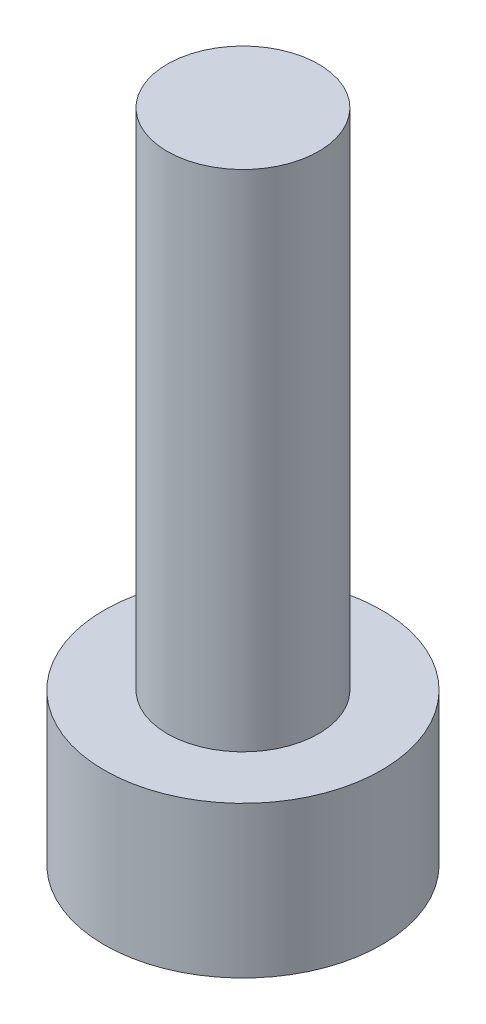
ISO-10303-21;
HEADER;
FILE_DESCRIPTION(('STEP AP214'),'2;1');
FILE_NAME('part.step','',(''),(''),'','','');
FILE_SCHEMA(('AUTOMOTIVE_DESIGN { 1 0 10303 214 1 1 1 1 }'));
ENDSEC;
DATA;
#1=APPLICATION_CONTEXT('core data for automotive mechanical design processes');
#2=APPLICATION_PROTOCOL_DEFINITION('international standard','automotive_design',2000,#1);
#3=PRODUCT_CONTEXT('',#1,'mechanical');
#4=PRODUCT('Part','Part','',(#3));
#5=PRODUCT_RELATED_PRODUCT_CATEGORY('part','',(#4));
#6=PRODUCT_DEFINITION_FORMATION('','',#4);
#7=PRODUCT_DEFINITION_CONTEXT('part definition',#1,'design');
#8=PRODUCT_DEFINITION('design','',#6,#7);
#9=PRODUCT_DEFINITION_SHAPE('','',#8);
#10=(LENGTH_UNIT() NAMED_UNIT(*) SI_UNIT(.MILLI.,.METRE.));
#11=(NAMED_UNIT(*) PLANE_ANGLE_UNIT() SI_UNIT($,.RADIAN.));
#12=(NAMED_UNIT(*) SI_UNIT($,.STERADIAN.) SOLID_ANGLE_UNIT());
#13=UNCERTAINTY_MEASURE_WITH_UNIT(LENGTH_MEASURE(1.E-05),#10,'distance_accuracy_value','');
#14=(GEOMETRIC_REPRESENTATION_CONTEXT(3) GLOBAL_UNCERTAINTY_ASSIGNED_CONTEXT((#13)) GLOBAL_UNIT_ASSIGNED_CONTEXT((#10,
#11,#12)) REPRESENTATION_CONTEXT('',''));
#15=CARTESIAN_POINT('',(0.,0.,0.));
#16=DIRECTION('',(0.,0.,1.));
#17=DIRECTION('',(1.,0.,0.));
#18=AXIS2_PLACEMENT_3D('',#15,#16,#17);
#19=CARTESIAN_POINT('',(0.,0.,0.));
#20=DIRECTION('',(0.,1.,0.));
#21=DIRECTION('',(0.,0.,1.));
#22=AXIS2_PLACEMENT_3D('',#19,#20,#21);
#23=PLANE('',#22);
#24=DIRECTION('',(0.866025403784439,0.,0.5));
#25=VECTOR('',#24,1.);
#26=CARTESIAN_POINT('',(0.,0.,-1.375));
#27=LINE('',#26,#25);
#28=CARTESIAN_POINT('',(0.,0.,-1.375));
#29=VERTEX_POINT('',#28);
#30=CARTESIAN_POINT('',(1.1907849302036,0.,-0.6875));
#31=VERTEX_POINT('',#30);
#32=EDGE_CURVE('E122',#29,#31,#27,.T.);
#33=ORIENTED_EDGE('',*,*,#32,.F.);
#34=DIRECTION('',(0.866025403784439,0.,-0.5));
#35=VECTOR('',#34,1.);
#36=CARTESIAN_POINT('',(-1.1907849302036,0.,-0.6875));
#37=LINE('',#36,#35);
#38=CARTESIAN_POINT('',(-1.1907849302036,0.,-0.6875));
#39=VERTEX_POINT('',#38);
#40=EDGE_CURVE('E48',#39,#29,#37,.T.);
#41=ORIENTED_EDGE('',*,*,#40,.F.);
#42=DIRECTION('',(0.,0.,-1.));
#43=VECTOR('',#42,1.);
#44=CARTESIAN_POINT('',(-1.1907849302036,0.,0.6875));
#45=LINE('',#44,#43);
#46=CARTESIAN_POINT('',(-1.1907849302036,0.,0.6875));
#47=VERTEX_POINT('',#46);
#48=EDGE_CURVE('E131',#47,#39,#45,.T.);
#49=ORIENTED_EDGE('',*,*,#48,.F.);
#50=DIRECTION('',(-0.866025403784439,0.,-0.5));
#51=VECTOR('',#50,1.);
#52=CARTESIAN_POINT('',(0.,0.,1.375));
#53=LINE('',#52,#51);
#54=CARTESIAN_POINT('',(0.,0.,1.375));
#55=VERTEX_POINT('',#54);
#56=EDGE_CURVE('E129',#55,#47,#53,.T.);
#57=ORIENTED_EDGE('',*,*,#56,.F.);
#58=DIRECTION('',(-0.866025403784439,0.,0.5));
#59=VECTOR('',#58,1.);
#60=CARTESIAN_POINT('',(1.1907849302036,0.,0.687500000000001));
#61=LINE('',#60,#59);
#62=CARTESIAN_POINT('',(1.1907849302036,0.,0.687500000000001));
#63=VERTEX_POINT('',#62);
#64=EDGE_CURVE('E96',#63,#55,#61,.T.);
#65=ORIENTED_EDGE('',*,*,#64,.F.);
#66=DIRECTION('',(0.,0.,1.));
#67=VECTOR('',#66,1.);
#68=CARTESIAN_POINT('',(1.1907849302036,0.,-0.6875));
#69=LINE('',#68,#67);
#70=EDGE_CURVE('E125',#31,#63,#69,.T.);
#71=ORIENTED_EDGE('',*,*,#70,.F.);
#72=EDGE_LOOP('',(#33,#41,#49,#57,#65,#71));
#73=FACE_BOUND('',#72,.T.);
#74=CARTESIAN_POINT('',(0.,0.,0.));
#75=DIRECTION('',(0.,1.,0.));
#76=DIRECTION('',(0.,0.,1.));
#77=AXIS2_PLACEMENT_3D('',#74,#75,#76);
#78=CIRCLE('',#77,2.75);
#79=CARTESIAN_POINT('',(0.,0.,2.75));
#80=VERTEX_POINT('',#79);
#81=EDGE_CURVE('E11',#80,#80,#78,.T.);
#82=ORIENTED_EDGE('',*,*,#81,.F.);
#83=EDGE_LOOP('',(#82));
#84=FACE_BOUND('',#83,.T.);
#85=ADVANCED_FACE('F34',(#73,#84),#23,.F.);
#86=CARTESIAN_POINT('',(0.,5.07932498206899,0.));
#87=DIRECTION('',(0.,1.,0.));
#88=DIRECTION('',(0.,0.,1.));
#89=AXIS2_PLACEMENT_3D('',#86,#87,#88);
#90=CYLINDRICAL_SURFACE('',#89,2.75);
#91=CARTESIAN_POINT('',(0.,3.,0.));
#92=DIRECTION('',(0.,1.,0.));
#93=DIRECTION('',(0.,0.,1.));
#94=AXIS2_PLACEMENT_3D('',#91,#92,#93);
#95=CIRCLE('',#94,2.75);
#96=CARTESIAN_POINT('',(0.,3.,2.75));
#97=VERTEX_POINT('',#96);
#98=EDGE_CURVE('E41',#97,#97,#95,.T.);
#99=ORIENTED_EDGE('',*,*,#98,.F.);
#100=EDGE_LOOP('',(#99));
#101=FACE_BOUND('',#100,.T.);
#102=ORIENTED_EDGE('',*,*,#81,.T.);
#103=EDGE_LOOP('',(#102));
#104=FACE_BOUND('',#103,.T.);
#105=ADVANCED_FACE('F150',(#101,#104),#90,.T.);
#106=CARTESIAN_POINT('',(2.75,3.,0.));
#107=DIRECTION('',(0.,-1.,0.));
#108=DIRECTION('',(0.,0.,-1.));
#109=AXIS2_PLACEMENT_3D('',#106,#107,#108);
#110=PLANE('',#109);
#111=CARTESIAN_POINT('',(0.,3.,0.));
#112=DIRECTION('',(0.,1.,0.));
#113=DIRECTION('',(0.,0.,1.));
#114=AXIS2_PLACEMENT_3D('',#111,#112,#113);
#115=CIRCLE('',#114,1.5);
#116=CARTESIAN_POINT('',(0.,3.,1.5));
#117=VERTEX_POINT('',#116);
#118=EDGE_CURVE('E143',#117,#117,#115,.T.);
#119=ORIENTED_EDGE('',*,*,#118,.F.);
#120=EDGE_LOOP('',(#119));
#121=FACE_BOUND('',#120,.T.);
#122=ORIENTED_EDGE('',*,*,#98,.T.);
#123=EDGE_LOOP('',(#122));
#124=FACE_BOUND('',#123,.T.);
#125=ADVANCED_FACE('F148',(#121,#124),#110,.F.);
#126=CARTESIAN_POINT('',(0.,5.07932498206899,0.));
#127=DIRECTION('',(0.,1.,0.));
#128=DIRECTION('',(0.,0.,1.));
#129=AXIS2_PLACEMENT_3D('',#126,#127,#128);
#130=CYLINDRICAL_SURFACE('',#129,1.5);
#131=CARTESIAN_POINT('',(0.,13.,0.));
#132=DIRECTION('',(0.,1.,0.));
#133=DIRECTION('',(0.,0.,1.));
#134=AXIS2_PLACEMENT_3D('',#131,#132,#133);
#135=CIRCLE('',#134,1.5);
#136=CARTESIAN_POINT('',(0.,13.,1.5));
#137=VERTEX_POINT('',#136);
#138=EDGE_CURVE('E135',#137,#137,#135,.T.);
#139=ORIENTED_EDGE('',*,*,#138,.F.);
#140=EDGE_LOOP('',(#139));
#141=FACE_BOUND('',#140,.T.);
#142=ORIENTED_EDGE('',*,*,#118,.T.);
#143=EDGE_LOOP('',(#142));
#144=FACE_BOUND('',#143,.T.);
#145=ADVANCED_FACE('F175',(#141,#144),#130,.T.);
#146=CARTESIAN_POINT('',(1.5,13.,0.));
#147=DIRECTION('',(0.,-1.,0.));
#148=DIRECTION('',(0.,0.,-1.));
#149=AXIS2_PLACEMENT_3D('',#146,#147,#148);
#150=PLANE('',#149);
#151=ORIENTED_EDGE('',*,*,#138,.T.);
#152=EDGE_LOOP('',(#151));
#153=FACE_BOUND('',#152,.T.);
#154=ADVANCED_FACE('F168',(#153),#150,.F.);
#155=CARTESIAN_POINT('',(-1.1907849302036,1.5,-0.6875));
#156=DIRECTION('',(-0.5,0.,-0.866025403784439));
#157=DIRECTION('',(-0.866025403784439,0.,0.5));
#158=AXIS2_PLACEMENT_3D('',#155,#156,#157);
#159=PLANE('',#158);
#160=ORIENTED_EDGE('',*,*,#40,.T.);
#161=DIRECTION('',(0.,-1.,0.));
#162=VECTOR('',#161,1.);
#163=CARTESIAN_POINT('',(0.,1.5,-1.375));
#164=LINE('',#163,#162);
#165=CARTESIAN_POINT('',(0.,1.5,-1.375));
#166=VERTEX_POINT('',#165);
#167=EDGE_CURVE('E78',#166,#29,#164,.T.);
#168=ORIENTED_EDGE('',*,*,#167,.F.);
#169=DIRECTION('',(0.866025403784439,0.,-0.5));
#170=VECTOR('',#169,1.);
#171=CARTESIAN_POINT('',(-1.1907849302036,1.5,-0.6875));
#172=LINE('',#171,#170);
#173=CARTESIAN_POINT('',(-1.1907849302036,1.5,-0.6875));
#174=VERTEX_POINT('',#173);
#175=EDGE_CURVE('E133',#174,#166,#172,.T.);
#176=ORIENTED_EDGE('',*,*,#175,.F.);
#177=DIRECTION('',(0.,-1.,0.));
#178=VECTOR('',#177,1.);
#179=CARTESIAN_POINT('',(-1.1907849302036,1.5,-0.6875));
#180=LINE('',#179,#178);
#181=EDGE_CURVE('E56',#174,#39,#180,.T.);
#182=ORIENTED_EDGE('',*,*,#181,.T.);
#183=EDGE_LOOP('',(#160,#168,#176,#182));
#184=FACE_BOUND('',#183,.T.);
#185=ADVANCED_FACE('F165',(#184),#159,.F.);
#186=CARTESIAN_POINT('',(-1.1907849302036,1.5,0.6875));
#187=DIRECTION('',(-1.,0.,0.));
#188=DIRECTION('',(0.,0.,1.));
#189=AXIS2_PLACEMENT_3D('',#186,#187,#188);
#190=PLANE('',#189);
#191=ORIENTED_EDGE('',*,*,#48,.T.);
#192=ORIENTED_EDGE('',*,*,#181,.F.);
#193=DIRECTION('',(0.,0.,-1.));
#194=VECTOR('',#193,1.);
#195=CARTESIAN_POINT('',(-1.1907849302036,1.5,0.6875));
#196=LINE('',#195,#194);
#197=CARTESIAN_POINT('',(-1.1907849302036,1.5,0.6875));
#198=VERTEX_POINT('',#197);
#199=EDGE_CURVE('E108',#198,#174,#196,.T.);
#200=ORIENTED_EDGE('',*,*,#199,.F.);
#201=DIRECTION('',(0.,-1.,0.));
#202=VECTOR('',#201,1.);
#203=CARTESIAN_POINT('',(-1.1907849302036,1.5,0.6875));
#204=LINE('',#203,#202);
#205=EDGE_CURVE('E100',#198,#47,#204,.T.);
#206=ORIENTED_EDGE('',*,*,#205,.T.);
#207=EDGE_LOOP('',(#191,#192,#200,#206));
#208=FACE_BOUND('',#207,.T.);
#209=ADVANCED_FACE('F167',(#208),#190,.F.);
#210=CARTESIAN_POINT('',(0.,1.5,1.375));
#211=DIRECTION('',(-0.5,0.,0.866025403784439));
#212=DIRECTION('',(0.866025403784439,0.,0.5));
#213=AXIS2_PLACEMENT_3D('',#210,#211,#212);
#214=PLANE('',#213);
#215=ORIENTED_EDGE('',*,*,#56,.T.);
#216=ORIENTED_EDGE('',*,*,#205,.F.);
#217=DIRECTION('',(-0.866025403784439,0.,-0.5));
#218=VECTOR('',#217,1.);
#219=CARTESIAN_POINT('',(0.,1.5,1.375));
#220=LINE('',#219,#218);
#221=CARTESIAN_POINT('',(0.,1.5,1.375));
#222=VERTEX_POINT('',#221);
#223=EDGE_CURVE('E104',#222,#198,#220,.T.);
#224=ORIENTED_EDGE('',*,*,#223,.F.);
#225=DIRECTION('',(0.,-1.,0.));
#226=VECTOR('',#225,1.);
#227=CARTESIAN_POINT('',(0.,1.5,1.375));
#228=LINE('',#227,#226);
#229=EDGE_CURVE('E89',#222,#55,#228,.T.);
#230=ORIENTED_EDGE('',*,*,#229,.T.);
#231=EDGE_LOOP('',(#215,#216,#224,#230));
#232=FACE_BOUND('',#231,.T.);
#233=ADVANCED_FACE('F105',(#232),#214,.F.);
#234=CARTESIAN_POINT('',(1.1907849302036,1.5,0.687500000000001));
#235=DIRECTION('',(0.5,0.,0.866025403784439));
#236=DIRECTION('',(0.866025403784439,0.,-0.5));
#237=AXIS2_PLACEMENT_3D('',#234,#235,#236);
#238=PLANE('',#237);
#239=ORIENTED_EDGE('',*,*,#64,.T.);
#240=ORIENTED_EDGE('',*,*,#229,.F.);
#241=DIRECTION('',(-0.866025403784439,0.,0.5));
#242=VECTOR('',#241,1.);
#243=CARTESIAN_POINT('',(1.1907849302036,1.5,0.687500000000001));
#244=LINE('',#243,#242);
#245=CARTESIAN_POINT('',(1.1907849302036,1.5,0.687500000000001));
#246=VERTEX_POINT('',#245);
#247=EDGE_CURVE('E93',#246,#222,#244,.T.);
#248=ORIENTED_EDGE('',*,*,#247,.F.);
#249=DIRECTION('',(0.,-1.,0.));
#250=VECTOR('',#249,1.);
#251=CARTESIAN_POINT('',(1.1907849302036,1.5,0.687500000000001));
#252=LINE('',#251,#250);
#253=EDGE_CURVE('E101',#246,#63,#252,.T.);
#254=ORIENTED_EDGE('',*,*,#253,.T.);
#255=EDGE_LOOP('',(#239,#240,#248,#254));
#256=FACE_BOUND('',#255,.T.);
#257=ADVANCED_FACE('F91',(#256),#238,.F.);
#258=CARTESIAN_POINT('',(1.1907849302036,1.5,-0.6875));
#259=DIRECTION('',(1.,0.,0.));
#260=DIRECTION('',(0.,0.,-1.));
#261=AXIS2_PLACEMENT_3D('',#258,#259,#260);
#262=PLANE('',#261);
#263=ORIENTED_EDGE('',*,*,#70,.T.);
#264=ORIENTED_EDGE('',*,*,#253,.F.);
#265=DIRECTION('',(0.,0.,1.));
#266=VECTOR('',#265,1.);
#267=CARTESIAN_POINT('',(1.1907849302036,1.5,-0.6875));
#268=LINE('',#267,#266);
#269=CARTESIAN_POINT('',(1.1907849302036,1.5,-0.6875));
#270=VERTEX_POINT('',#269);
#271=EDGE_CURVE('E114',#270,#246,#268,.T.);
#272=ORIENTED_EDGE('',*,*,#271,.F.);
#273=DIRECTION('',(0.,-1.,0.));
#274=VECTOR('',#273,1.);
#275=CARTESIAN_POINT('',(1.1907849302036,1.5,-0.6875));
#276=LINE('',#275,#274);
#277=EDGE_CURVE('E138',#270,#31,#276,.T.);
#278=ORIENTED_EDGE('',*,*,#277,.T.);
#279=EDGE_LOOP('',(#263,#264,#272,#278));
#280=FACE_BOUND('',#279,.T.);
#281=ADVANCED_FACE('F232',(#280),#262,.F.);
#282=CARTESIAN_POINT('',(0.,1.5,-1.375));
#283=DIRECTION('',(0.5,0.,-0.866025403784439));
#284=DIRECTION('',(-0.866025403784439,0.,-0.5));
#285=AXIS2_PLACEMENT_3D('',#282,#283,#284);
#286=PLANE('',#285);
#287=ORIENTED_EDGE('',*,*,#32,.T.);
#288=ORIENTED_EDGE('',*,*,#277,.F.);
#289=DIRECTION('',(0.866025403784439,0.,0.5));
#290=VECTOR('',#289,1.);
#291=CARTESIAN_POINT('',(0.,1.5,-1.375));
#292=LINE('',#291,#290);
#293=EDGE_CURVE('E116',#166,#270,#292,.T.);
#294=ORIENTED_EDGE('',*,*,#293,.F.);
#295=ORIENTED_EDGE('',*,*,#167,.T.);
#296=EDGE_LOOP('',(#287,#288,#294,#295));
#297=FACE_BOUND('',#296,.T.);
#298=ADVANCED_FACE('F163',(#297),#286,.F.);
#299=CARTESIAN_POINT('',(0.,1.5,0.));
#300=DIRECTION('',(0.,-1.,0.));
#301=DIRECTION('',(0.,0.,-1.));
#302=AXIS2_PLACEMENT_3D('',#299,#300,#301);
#303=PLANE('',#302);
#304=ORIENTED_EDGE('',*,*,#175,.T.);
#305=ORIENTED_EDGE('',*,*,#293,.T.);
#306=ORIENTED_EDGE('',*,*,#271,.T.);
#307=ORIENTED_EDGE('',*,*,#247,.T.);
#308=ORIENTED_EDGE('',*,*,#223,.T.);
#309=ORIENTED_EDGE('',*,*,#199,.T.);
#310=EDGE_LOOP('',(#304,#305,#306,#307,#308,#309));
#311=FACE_BOUND('',#310,.T.);
#312=ADVANCED_FACE('F111',(#311),#303,.T.);
#313=CLOSED_SHELL('',(#85,#105,#125,#145,#154,#185,#209,#233,#257,#281,#298,#312));
#314=MANIFOLD_SOLID_BREP('B2',#313);
#315=ADVANCED_BREP_SHAPE_REPRESENTATION('',(#18,#314),#14);
#316=SHAPE_DEFINITION_REPRESENTATION(#9,#315);
ENDSEC;
END-ISO-10303-21;
